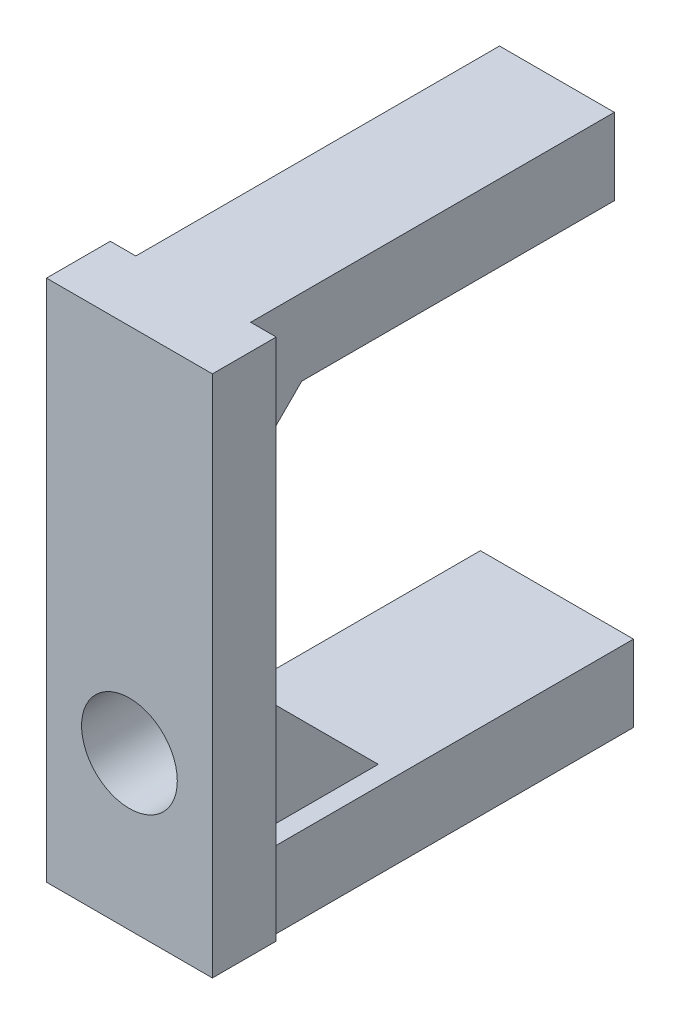
ISO-10303-21;
HEADER;
FILE_DESCRIPTION(('STEP AP214'),'2;1');
FILE_NAME('part.step','',(''),(''),'','','');
FILE_SCHEMA(('AUTOMOTIVE_DESIGN { 1 0 10303 214 1 1 1 1 }'));
ENDSEC;
DATA;
#1=APPLICATION_CONTEXT('core data for automotive mechanical design processes');
#2=APPLICATION_PROTOCOL_DEFINITION('international standard','automotive_design',2000,#1);
#3=PRODUCT_CONTEXT('',#1,'mechanical');
#4=PRODUCT('Part','Part','',(#3));
#5=PRODUCT_RELATED_PRODUCT_CATEGORY('part','',(#4));
#6=PRODUCT_DEFINITION_FORMATION('','',#4);
#7=PRODUCT_DEFINITION_CONTEXT('part definition',#1,'design');
#8=PRODUCT_DEFINITION('design','',#6,#7);
#9=PRODUCT_DEFINITION_SHAPE('','',#8);
#10=(LENGTH_UNIT() NAMED_UNIT(*) SI_UNIT(.MILLI.,.METRE.));
#11=(NAMED_UNIT(*) PLANE_ANGLE_UNIT() SI_UNIT($,.RADIAN.));
#12=(NAMED_UNIT(*) SI_UNIT($,.STERADIAN.) SOLID_ANGLE_UNIT());
#13=UNCERTAINTY_MEASURE_WITH_UNIT(LENGTH_MEASURE(1.E-05),#10,'distance_accuracy_value','');
#14=(GEOMETRIC_REPRESENTATION_CONTEXT(3) GLOBAL_UNCERTAINTY_ASSIGNED_CONTEXT((#13)) GLOBAL_UNIT_ASSIGNED_CONTEXT((#10,
#11,#12)) REPRESENTATION_CONTEXT('',''));
#15=CARTESIAN_POINT('',(0.,0.,0.));
#16=DIRECTION('',(0.,0.,1.));
#17=DIRECTION('',(1.,0.,0.));
#18=AXIS2_PLACEMENT_3D('',#15,#16,#17);
#19=CARTESIAN_POINT('',(0.,167.,83.));
#20=DIRECTION('',(0.,0.,1.));
#21=DIRECTION('',(1.,0.,0.));
#22=AXIS2_PLACEMENT_3D('',#19,#20,#21);
#23=PLANE('',#22);
#24=CARTESIAN_POINT('',(0.,167.,83.));
#25=DIRECTION('',(0.,0.,1.));
#26=DIRECTION('',(1.,0.,0.));
#27=AXIS2_PLACEMENT_3D('',#24,#25,#26);
#28=CIRCLE('',#27,1.4);
#29=CARTESIAN_POINT('',(1.4,167.,83.));
#30=VERTEX_POINT('',#29);
#31=EDGE_CURVE('E9',#30,#30,#28,.T.);
#32=ORIENTED_EDGE('',*,*,#31,.F.);
#33=EDGE_LOOP('',(#32));
#34=FACE_BOUND('',#33,.T.);
#35=ADVANCED_FACE('F14',(#34),#23,.F.);
#36=CARTESIAN_POINT('',(0.,161.,83.));
#37=DIRECTION('',(0.,0.,1.));
#38=DIRECTION('',(1.,0.,0.));
#39=AXIS2_PLACEMENT_3D('',#36,#37,#38);
#40=PLANE('',#39);
#41=CARTESIAN_POINT('',(0.,161.,83.));
#42=DIRECTION('',(0.,0.,1.));
#43=DIRECTION('',(1.,0.,0.));
#44=AXIS2_PLACEMENT_3D('',#41,#42,#43);
#45=CIRCLE('',#44,1.4);
#46=CARTESIAN_POINT('',(1.4,161.,83.));
#47=VERTEX_POINT('',#46);
#48=EDGE_CURVE('E261',#47,#47,#45,.T.);
#49=ORIENTED_EDGE('',*,*,#48,.F.);
#50=EDGE_LOOP('',(#49));
#51=FACE_BOUND('',#50,.T.);
#52=ADVANCED_FACE('F531',(#51),#40,.F.);
#53=CARTESIAN_POINT('',(6.,94.,83.));
#54=DIRECTION('',(0.,0.,1.));
#55=DIRECTION('',(1.,0.,0.));
#56=AXIS2_PLACEMENT_3D('',#53,#54,#55);
#57=PLANE('',#56);
#58=CARTESIAN_POINT('',(6.,94.,83.));
#59=DIRECTION('',(0.,0.,1.));
#60=DIRECTION('',(1.,0.,0.));
#61=AXIS2_PLACEMENT_3D('',#58,#59,#60);
#62=CIRCLE('',#61,1.4);
#63=CARTESIAN_POINT('',(7.4,94.,83.));
#64=VERTEX_POINT('',#63);
#65=EDGE_CURVE('E324',#64,#64,#62,.T.);
#66=ORIENTED_EDGE('',*,*,#65,.F.);
#67=EDGE_LOOP('',(#66));
#68=FACE_BOUND('',#67,.T.);
#69=ADVANCED_FACE('F536',(#68),#57,.F.);
#70=CARTESIAN_POINT('',(-6.,94.,83.));
#71=DIRECTION('',(0.,0.,1.));
#72=DIRECTION('',(1.,0.,0.));
#73=AXIS2_PLACEMENT_3D('',#70,#71,#72);
#74=PLANE('',#73);
#75=CARTESIAN_POINT('',(-6.,94.,83.));
#76=DIRECTION('',(0.,0.,1.));
#77=DIRECTION('',(1.,0.,0.));
#78=AXIS2_PLACEMENT_3D('',#75,#76,#77);
#79=CIRCLE('',#78,1.4);
#80=CARTESIAN_POINT('',(-4.6,94.,83.));
#81=VERTEX_POINT('',#80);
#82=EDGE_CURVE('E276',#81,#81,#79,.T.);
#83=ORIENTED_EDGE('',*,*,#82,.F.);
#84=EDGE_LOOP('',(#83));
#85=FACE_BOUND('',#84,.T.);
#86=ADVANCED_FACE('F555',(#85),#74,.F.);
#87=CARTESIAN_POINT('',(0.,167.,73.));
#88=DIRECTION('',(0.,0.,1.));
#89=DIRECTION('',(1.,0.,0.));
#90=AXIS2_PLACEMENT_3D('',#87,#88,#89);
#91=CYLINDRICAL_SURFACE('',#90,1.4);
#92=DIRECTION('',(0.,0.,1.));
#93=VECTOR('',#92,1.);
#94=CARTESIAN_POINT('',(1.4,167.,73.));
#95=LINE('',#94,#93);
#96=CARTESIAN_POINT('',(1.4,167.,73.));
#97=VERTEX_POINT('',#96);
#98=EDGE_CURVE('E25',#97,#30,#95,.T.);
#99=ORIENTED_EDGE('',*,*,#98,.F.);
#100=CARTESIAN_POINT('',(0.,167.,73.));
#101=DIRECTION('',(0.,0.,1.));
#102=DIRECTION('',(1.,0.,0.));
#103=AXIS2_PLACEMENT_3D('',#100,#101,#102);
#104=CIRCLE('',#103,1.4);
#105=EDGE_CURVE('E281',#97,#97,#104,.T.);
#106=ORIENTED_EDGE('',*,*,#105,.F.);
#107=ORIENTED_EDGE('',*,*,#98,.T.);
#108=ORIENTED_EDGE('',*,*,#31,.T.);
#109=EDGE_LOOP('',(#99,#106,#107,#108));
#110=FACE_BOUND('',#109,.T.);
#111=ADVANCED_FACE('F552',(#110),#91,.F.);
#112=CARTESIAN_POINT('',(0.,161.,73.));
#113=DIRECTION('',(0.,0.,1.));
#114=DIRECTION('',(1.,0.,0.));
#115=AXIS2_PLACEMENT_3D('',#112,#113,#114);
#116=CYLINDRICAL_SURFACE('',#115,1.4);
#117=DIRECTION('',(0.,0.,1.));
#118=VECTOR('',#117,1.);
#119=CARTESIAN_POINT('',(1.4,161.,73.));
#120=LINE('',#119,#118);
#121=CARTESIAN_POINT('',(1.4,161.,73.));
#122=VERTEX_POINT('',#121);
#123=EDGE_CURVE('E328',#122,#47,#120,.T.);
#124=ORIENTED_EDGE('',*,*,#123,.F.);
#125=CARTESIAN_POINT('',(0.,161.,73.));
#126=DIRECTION('',(0.,0.,1.));
#127=DIRECTION('',(1.,0.,0.));
#128=AXIS2_PLACEMENT_3D('',#125,#126,#127);
#129=CIRCLE('',#128,1.4);
#130=EDGE_CURVE('E284',#122,#122,#129,.T.);
#131=ORIENTED_EDGE('',*,*,#130,.F.);
#132=ORIENTED_EDGE('',*,*,#123,.T.);
#133=ORIENTED_EDGE('',*,*,#48,.T.);
#134=EDGE_LOOP('',(#124,#131,#132,#133));
#135=FACE_BOUND('',#134,.T.);
#136=ADVANCED_FACE('F16',(#135),#116,.F.);
#137=CARTESIAN_POINT('',(-9.,158.,73.));
#138=DIRECTION('',(0.,1.,0.));
#139=DIRECTION('',(1.,0.,0.));
#140=AXIS2_PLACEMENT_3D('',#137,#138,#139);
#141=PLANE('',#140);
#142=DIRECTION('',(-1.,0.,0.));
#143=VECTOR('',#142,1.);
#144=CARTESIAN_POINT('',(9.,158.,122.));
#145=LINE('',#144,#143);
#146=CARTESIAN_POINT('',(9.,158.,122.));
#147=VERTEX_POINT('',#146);
#148=CARTESIAN_POINT('',(-9.,158.,122.));
#149=VERTEX_POINT('',#148);
#150=EDGE_CURVE('E377',#147,#149,#145,.T.);
#151=ORIENTED_EDGE('',*,*,#150,.T.);
#152=DIRECTION('',(0.,0.,1.));
#153=VECTOR('',#152,1.);
#154=CARTESIAN_POINT('',(-9.,158.,73.));
#155=LINE('',#154,#153);
#156=CARTESIAN_POINT('',(-9.,158.,73.));
#157=VERTEX_POINT('',#156);
#158=EDGE_CURVE('E254',#157,#149,#155,.T.);
#159=ORIENTED_EDGE('',*,*,#158,.F.);
#160=DIRECTION('',(1.,0.,0.));
#161=VECTOR('',#160,1.);
#162=CARTESIAN_POINT('',(-9.,158.,73.));
#163=LINE('',#162,#161);
#164=CARTESIAN_POINT('',(9.,158.,73.));
#165=VERTEX_POINT('',#164);
#166=EDGE_CURVE('E299',#157,#165,#163,.T.);
#167=ORIENTED_EDGE('',*,*,#166,.T.);
#168=DIRECTION('',(0.,0.,1.));
#169=VECTOR('',#168,1.);
#170=CARTESIAN_POINT('',(9.,158.,73.));
#171=LINE('',#170,#169);
#172=EDGE_CURVE('E373',#165,#147,#171,.T.);
#173=ORIENTED_EDGE('',*,*,#172,.T.);
#174=EDGE_LOOP('',(#151,#159,#167,#173));
#175=FACE_BOUND('',#174,.T.);
#176=ADVANCED_FACE('F516',(#175),#141,.F.);
#177=CARTESIAN_POINT('',(6.,94.,73.));
#178=DIRECTION('',(0.,0.,1.));
#179=DIRECTION('',(1.,0.,0.));
#180=AXIS2_PLACEMENT_3D('',#177,#178,#179);
#181=CYLINDRICAL_SURFACE('',#180,1.4);
#182=DIRECTION('',(0.,0.,1.));
#183=VECTOR('',#182,1.);
#184=CARTESIAN_POINT('',(7.4,94.,73.));
#185=LINE('',#184,#183);
#186=CARTESIAN_POINT('',(7.4,94.,73.));
#187=VERTEX_POINT('',#186);
#188=EDGE_CURVE('E279',#187,#64,#185,.T.);
#189=ORIENTED_EDGE('',*,*,#188,.F.);
#190=CARTESIAN_POINT('',(6.,94.,73.));
#191=DIRECTION('',(0.,0.,1.));
#192=DIRECTION('',(1.,0.,0.));
#193=AXIS2_PLACEMENT_3D('',#190,#191,#192);
#194=CIRCLE('',#193,1.4);
#195=EDGE_CURVE('E217',#187,#187,#194,.T.);
#196=ORIENTED_EDGE('',*,*,#195,.F.);
#197=ORIENTED_EDGE('',*,*,#188,.T.);
#198=ORIENTED_EDGE('',*,*,#65,.T.);
#199=EDGE_LOOP('',(#189,#196,#197,#198));
#200=FACE_BOUND('',#199,.T.);
#201=ADVANCED_FACE('F560',(#200),#181,.F.);
#202=CARTESIAN_POINT('',(-6.,94.,73.));
#203=DIRECTION('',(0.,0.,1.));
#204=DIRECTION('',(1.,0.,0.));
#205=AXIS2_PLACEMENT_3D('',#202,#203,#204);
#206=CYLINDRICAL_SURFACE('',#205,1.4);
#207=DIRECTION('',(0.,0.,1.));
#208=VECTOR('',#207,1.);
#209=CARTESIAN_POINT('',(-4.6,94.,73.));
#210=LINE('',#209,#208);
#211=CARTESIAN_POINT('',(-4.6,94.,73.));
#212=VERTEX_POINT('',#211);
#213=EDGE_CURVE('E280',#212,#81,#210,.T.);
#214=ORIENTED_EDGE('',*,*,#213,.F.);
#215=CARTESIAN_POINT('',(-6.,94.,73.));
#216=DIRECTION('',(0.,0.,1.));
#217=DIRECTION('',(1.,0.,0.));
#218=AXIS2_PLACEMENT_3D('',#215,#216,#217);
#219=CIRCLE('',#218,1.4);
#220=EDGE_CURVE('E224',#212,#212,#219,.T.);
#221=ORIENTED_EDGE('',*,*,#220,.F.);
#222=ORIENTED_EDGE('',*,*,#213,.T.);
#223=ORIENTED_EDGE('',*,*,#82,.T.);
#224=EDGE_LOOP('',(#214,#221,#222,#223));
#225=FACE_BOUND('',#224,.T.);
#226=ADVANCED_FACE('F722',(#225),#206,.F.);
#227=CARTESIAN_POINT('',(0.,150.,130.));
#228=DIRECTION('',(0.,-0.707106781186548,-0.707106781186548));
#229=DIRECTION('',(0.,-0.707106781186548,0.707106781186548));
#230=AXIS2_PLACEMENT_3D('',#227,#228,#229);
#231=PLANE('',#230);
#232=DIRECTION('',(1.,0.,0.));
#233=VECTOR('',#232,1.);
#234=CARTESIAN_POINT('',(-9.,150.,130.));
#235=LINE('',#234,#233);
#236=CARTESIAN_POINT('',(-9.,150.,130.));
#237=VERTEX_POINT('',#236);
#238=CARTESIAN_POINT('',(9.,150.,130.));
#239=VERTEX_POINT('',#238);
#240=EDGE_CURVE('E419',#237,#239,#235,.T.);
#241=ORIENTED_EDGE('',*,*,#240,.F.);
#242=DIRECTION('',(0.,0.707106781186548,-0.707106781186548));
#243=VECTOR('',#242,1.);
#244=CARTESIAN_POINT('',(-9.,150.,130.));
#245=LINE('',#244,#243);
#246=EDGE_CURVE('E18',#237,#149,#245,.T.);
#247=ORIENTED_EDGE('',*,*,#246,.T.);
#248=ORIENTED_EDGE('',*,*,#150,.F.);
#249=DIRECTION('',(0.,0.707106781186548,-0.707106781186548));
#250=VECTOR('',#249,1.);
#251=CARTESIAN_POINT('',(9.,150.,130.));
#252=LINE('',#251,#250);
#253=EDGE_CURVE('E334',#239,#147,#252,.T.);
#254=ORIENTED_EDGE('',*,*,#253,.F.);
#255=EDGE_LOOP('',(#241,#247,#248,#254));
#256=FACE_BOUND('',#255,.T.);
#257=ADVANCED_FACE('F514',(#256),#231,.T.);
#258=CARTESIAN_POINT('',(9.,107.07106781186,122.92893218813));
#259=DIRECTION('',(-1.,0.,0.));
#260=DIRECTION('',(0.,0.,1.));
#261=AXIS2_PLACEMENT_3D('',#258,#259,#260);
#262=PLANE('',#261);
#263=DIRECTION('',(0.,0.,1.));
#264=VECTOR('',#263,1.);
#265=CARTESIAN_POINT('',(9.,100.,110.));
#266=LINE('',#265,#264);
#267=CARTESIAN_POINT('',(9.,100.,110.));
#268=VERTEX_POINT('',#267);
#269=CARTESIAN_POINT('',(9.,100.,130.));
#270=VERTEX_POINT('',#269);
#271=EDGE_CURVE('E321',#268,#270,#266,.T.);
#272=ORIENTED_EDGE('',*,*,#271,.F.);
#273=DIRECTION('',(0.,-0.707106781186548,-0.707106781186548));
#274=VECTOR('',#273,1.);
#275=CARTESIAN_POINT('',(9.,120.,130.));
#276=LINE('',#275,#274);
#277=CARTESIAN_POINT('',(9.,120.,130.));
#278=VERTEX_POINT('',#277);
#279=EDGE_CURVE('E320',#278,#268,#276,.T.);
#280=ORIENTED_EDGE('',*,*,#279,.F.);
#281=DIRECTION('',(0.,1.,0.));
#282=VECTOR('',#281,1.);
#283=CARTESIAN_POINT('',(9.,100.,130.));
#284=LINE('',#283,#282);
#285=EDGE_CURVE('E406',#270,#278,#284,.T.);
#286=ORIENTED_EDGE('',*,*,#285,.F.);
#287=EDGE_LOOP('',(#272,#280,#286));
#288=FACE_BOUND('',#287,.T.);
#289=ADVANCED_FACE('F447',(#288),#262,.F.);
#290=CARTESIAN_POINT('',(0.,120.,130.));
#291=DIRECTION('',(0.,0.707106781186548,-0.707106781186548));
#292=DIRECTION('',(-1.,0.,0.));
#293=AXIS2_PLACEMENT_3D('',#290,#291,#292);
#294=PLANE('',#293);
#295=CARTESIAN_POINT('',(0.,112.,122.));
#296=DIRECTION('',(0.,0.707106781186548,-0.707106781186548));
#297=DIRECTION('',(0.,0.707106781186548,0.707106781186548));
#298=AXIS2_PLACEMENT_3D('',#295,#296,#297);
#299=ELLIPSE('',#298,10.606601717798,7.5);
#300=CARTESIAN_POINT('',(7.5,112.,122.));
#301=VERTEX_POINT('',#300);
#302=EDGE_CURVE('E401',#301,#301,#299,.T.);
#303=ORIENTED_EDGE('',*,*,#302,.F.);
#304=EDGE_LOOP('',(#303));
#305=FACE_BOUND('',#304,.T.);
#306=DIRECTION('',(-1.,0.,0.));
#307=VECTOR('',#306,1.);
#308=CARTESIAN_POINT('',(9.,120.,130.));
#309=LINE('',#308,#307);
#310=CARTESIAN_POINT('',(-9.,120.,130.));
#311=VERTEX_POINT('',#310);
#312=EDGE_CURVE('E385',#278,#311,#309,.T.);
#313=ORIENTED_EDGE('',*,*,#312,.F.);
#314=ORIENTED_EDGE('',*,*,#279,.T.);
#315=DIRECTION('',(1.,0.,0.));
#316=VECTOR('',#315,1.);
#317=CARTESIAN_POINT('',(-9.,100.,110.));
#318=LINE('',#317,#316);
#319=CARTESIAN_POINT('',(-9.,100.,110.));
#320=VERTEX_POINT('',#319);
#321=EDGE_CURVE('E269',#320,#268,#318,.T.);
#322=ORIENTED_EDGE('',*,*,#321,.F.);
#323=DIRECTION('',(0.,-0.707106781186548,-0.707106781186548));
#324=VECTOR('',#323,1.);
#325=CARTESIAN_POINT('',(-9.,120.,130.));
#326=LINE('',#325,#324);
#327=EDGE_CURVE('E317',#311,#320,#326,.T.);
#328=ORIENTED_EDGE('',*,*,#327,.F.);
#329=EDGE_LOOP('',(#313,#314,#322,#328));
#330=FACE_BOUND('',#329,.T.);
#331=ADVANCED_FACE('F440',(#305,#330),#294,.T.);
#332=CARTESIAN_POINT('',(-9.,107.07106781186,122.92893218813));
#333=DIRECTION('',(-1.,0.,0.));
#334=DIRECTION('',(0.,0.,1.));
#335=AXIS2_PLACEMENT_3D('',#332,#333,#334);
#336=PLANE('',#335);
#337=DIRECTION('',(0.,1.,0.));
#338=VECTOR('',#337,1.);
#339=CARTESIAN_POINT('',(-9.,100.,130.));
#340=LINE('',#339,#338);
#341=CARTESIAN_POINT('',(-9.,100.,130.));
#342=VERTEX_POINT('',#341);
#343=EDGE_CURVE('E381',#342,#311,#340,.T.);
#344=ORIENTED_EDGE('',*,*,#343,.T.);
#345=ORIENTED_EDGE('',*,*,#327,.T.);
#346=DIRECTION('',(0.,0.,1.));
#347=VECTOR('',#346,1.);
#348=CARTESIAN_POINT('',(-9.,100.,110.));
#349=LINE('',#348,#347);
#350=EDGE_CURVE('E258',#320,#342,#349,.T.);
#351=ORIENTED_EDGE('',*,*,#350,.T.);
#352=EDGE_LOOP('',(#344,#345,#351));
#353=FACE_BOUND('',#352,.T.);
#354=ADVANCED_FACE('F445',(#353),#336,.T.);
#355=CARTESIAN_POINT('',(-12.,100.,73.));
#356=DIRECTION('',(0.,1.,0.));
#357=DIRECTION('',(1.,0.,0.));
#358=AXIS2_PLACEMENT_3D('',#355,#356,#357);
#359=PLANE('',#358);
#360=DIRECTION('',(0.,0.,1.));
#361=VECTOR('',#360,1.);
#362=CARTESIAN_POINT('',(12.,100.,73.));
#363=LINE('',#362,#361);
#364=CARTESIAN_POINT('',(12.,100.,73.));
#365=VERTEX_POINT('',#364);
#366=CARTESIAN_POINT('',(12.,100.,130.));
#367=VERTEX_POINT('',#366);
#368=EDGE_CURVE('E229',#365,#367,#363,.T.);
#369=ORIENTED_EDGE('',*,*,#368,.F.);
#370=DIRECTION('',(1.,0.,0.));
#371=VECTOR('',#370,1.);
#372=CARTESIAN_POINT('',(-12.,100.,73.));
#373=LINE('',#372,#371);
#374=CARTESIAN_POINT('',(-12.,100.,73.));
#375=VERTEX_POINT('',#374);
#376=EDGE_CURVE('E210',#375,#365,#373,.T.);
#377=ORIENTED_EDGE('',*,*,#376,.F.);
#378=DIRECTION('',(0.,0.,1.));
#379=VECTOR('',#378,1.);
#380=CARTESIAN_POINT('',(-12.,100.,73.));
#381=LINE('',#380,#379);
#382=CARTESIAN_POINT('',(-12.,100.,130.));
#383=VERTEX_POINT('',#382);
#384=EDGE_CURVE('E208',#375,#383,#381,.T.);
#385=ORIENTED_EDGE('',*,*,#384,.T.);
#386=DIRECTION('',(1.,0.,0.));
#387=VECTOR('',#386,1.);
#388=CARTESIAN_POINT('',(-12.,100.,130.));
#389=LINE('',#388,#387);
#390=EDGE_CURVE('E241',#383,#342,#389,.T.);
#391=ORIENTED_EDGE('',*,*,#390,.T.);
#392=ORIENTED_EDGE('',*,*,#350,.F.);
#393=ORIENTED_EDGE('',*,*,#321,.T.);
#394=ORIENTED_EDGE('',*,*,#271,.T.);
#395=DIRECTION('',(1.,0.,0.));
#396=VECTOR('',#395,1.);
#397=CARTESIAN_POINT('',(-12.,100.,130.));
#398=LINE('',#397,#396);
#399=EDGE_CURVE('E306',#270,#367,#398,.T.);
#400=ORIENTED_EDGE('',*,*,#399,.T.);
#401=EDGE_LOOP('',(#369,#377,#385,#391,#392,#393,#394,#400));
#402=FACE_BOUND('',#401,.T.);
#403=ADVANCED_FACE('F226',(#402),#359,.T.);
#404=CARTESIAN_POINT('',(-9.,158.,73.));
#405=DIRECTION('',(1.,0.,0.));
#406=DIRECTION('',(0.,1.,0.));
#407=AXIS2_PLACEMENT_3D('',#404,#405,#406);
#408=PLANE('',#407);
#409=ORIENTED_EDGE('',*,*,#246,.F.);
#410=DIRECTION('',(0.,-1.,0.));
#411=VECTOR('',#410,1.);
#412=CARTESIAN_POINT('',(-9.,170.,130.));
#413=LINE('',#412,#411);
#414=CARTESIAN_POINT('',(-9.,170.,130.));
#415=VERTEX_POINT('',#414);
#416=EDGE_CURVE('E316',#415,#237,#413,.T.);
#417=ORIENTED_EDGE('',*,*,#416,.F.);
#418=DIRECTION('',(0.,0.,1.));
#419=VECTOR('',#418,1.);
#420=CARTESIAN_POINT('',(-9.,170.,73.));
#421=LINE('',#420,#419);
#422=CARTESIAN_POINT('',(-9.,170.,73.));
#423=VERTEX_POINT('',#422);
#424=EDGE_CURVE('E311',#423,#415,#421,.T.);
#425=ORIENTED_EDGE('',*,*,#424,.F.);
#426=DIRECTION('',(0.,1.,0.));
#427=VECTOR('',#426,1.);
#428=CARTESIAN_POINT('',(-9.,158.,73.));
#429=LINE('',#428,#427);
#430=EDGE_CURVE('E292',#157,#423,#429,.T.);
#431=ORIENTED_EDGE('',*,*,#430,.F.);
#432=ORIENTED_EDGE('',*,*,#158,.T.);
#433=EDGE_LOOP('',(#409,#417,#425,#431,#432));
#434=FACE_BOUND('',#433,.T.);
#435=ADVANCED_FACE('F510',(#434),#408,.F.);
#436=CARTESIAN_POINT('',(-9.,158.,73.));
#437=DIRECTION('',(0.,0.,1.));
#438=DIRECTION('',(1.,0.,0.));
#439=AXIS2_PLACEMENT_3D('',#436,#437,#438);
#440=PLANE('',#439);
#441=ORIENTED_EDGE('',*,*,#105,.T.);
#442=EDGE_LOOP('',(#441));
#443=FACE_BOUND('',#442,.T.);
#444=ORIENTED_EDGE('',*,*,#130,.T.);
#445=EDGE_LOOP('',(#444));
#446=FACE_BOUND('',#445,.T.);
#447=DIRECTION('',(1.,0.,0.));
#448=VECTOR('',#447,1.);
#449=CARTESIAN_POINT('',(-9.,170.,73.));
#450=LINE('',#449,#448);
#451=CARTESIAN_POINT('',(9.,170.,73.));
#452=VERTEX_POINT('',#451);
#453=EDGE_CURVE('E308',#423,#452,#450,.T.);
#454=ORIENTED_EDGE('',*,*,#453,.T.);
#455=DIRECTION('',(0.,1.,0.));
#456=VECTOR('',#455,1.);
#457=CARTESIAN_POINT('',(9.,158.,73.));
#458=LINE('',#457,#456);
#459=EDGE_CURVE('E147',#165,#452,#458,.T.);
#460=ORIENTED_EDGE('',*,*,#459,.F.);
#461=ORIENTED_EDGE('',*,*,#166,.F.);
#462=ORIENTED_EDGE('',*,*,#430,.T.);
#463=EDGE_LOOP('',(#454,#460,#461,#462));
#464=FACE_BOUND('',#463,.T.);
#465=ADVANCED_FACE('F518',(#443,#446,#464),#440,.F.);
#466=CARTESIAN_POINT('',(9.,158.,73.));
#467=DIRECTION('',(1.,0.,0.));
#468=DIRECTION('',(0.,1.,0.));
#469=AXIS2_PLACEMENT_3D('',#466,#467,#468);
#470=PLANE('',#469);
#471=ORIENTED_EDGE('',*,*,#172,.F.);
#472=ORIENTED_EDGE('',*,*,#459,.T.);
#473=DIRECTION('',(0.,0.,1.));
#474=VECTOR('',#473,1.);
#475=CARTESIAN_POINT('',(9.,170.,73.));
#476=LINE('',#475,#474);
#477=CARTESIAN_POINT('',(9.,170.,130.));
#478=VERTEX_POINT('',#477);
#479=EDGE_CURVE('E312',#452,#478,#476,.T.);
#480=ORIENTED_EDGE('',*,*,#479,.T.);
#481=DIRECTION('',(0.,1.,0.));
#482=VECTOR('',#481,1.);
#483=CARTESIAN_POINT('',(9.,150.,130.));
#484=LINE('',#483,#482);
#485=EDGE_CURVE('E136',#239,#478,#484,.T.);
#486=ORIENTED_EDGE('',*,*,#485,.F.);
#487=ORIENTED_EDGE('',*,*,#253,.T.);
#488=EDGE_LOOP('',(#471,#472,#480,#486,#487));
#489=FACE_BOUND('',#488,.T.);
#490=ADVANCED_FACE('F470',(#489),#470,.T.);
#491=CARTESIAN_POINT('',(0.,112.,85.));
#492=DIRECTION('',(0.,0.,1.));
#493=DIRECTION('',(1.,0.,0.));
#494=AXIS2_PLACEMENT_3D('',#491,#492,#493);
#495=CYLINDRICAL_SURFACE('',#494,7.5);
#496=DIRECTION('',(0.,0.,1.));
#497=VECTOR('',#496,1.);
#498=CARTESIAN_POINT('',(7.5,112.,85.));
#499=LINE('',#498,#497);
#500=CARTESIAN_POINT('',(7.5,112.,140.));
#501=VERTEX_POINT('',#500);
#502=EDGE_CURVE('E216',#301,#501,#499,.T.);
#503=ORIENTED_EDGE('',*,*,#502,.F.);
#504=ORIENTED_EDGE('',*,*,#302,.T.);
#505=ORIENTED_EDGE('',*,*,#502,.T.);
#506=CARTESIAN_POINT('',(0.,112.,140.));
#507=DIRECTION('',(0.,0.,1.));
#508=DIRECTION('',(1.,0.,0.));
#509=AXIS2_PLACEMENT_3D('',#506,#507,#508);
#510=CIRCLE('',#509,7.5);
#511=EDGE_CURVE('E340',#501,#501,#510,.T.);
#512=ORIENTED_EDGE('',*,*,#511,.T.);
#513=EDGE_LOOP('',(#503,#504,#505,#512));
#514=FACE_BOUND('',#513,.T.);
#515=ADVANCED_FACE('F526',(#514),#495,.F.);
#516=CARTESIAN_POINT('',(-12.,88.,73.));
#517=DIRECTION('',(1.,0.,0.));
#518=DIRECTION('',(0.,1.,0.));
#519=AXIS2_PLACEMENT_3D('',#516,#517,#518);
#520=PLANE('',#519);
#521=DIRECTION('',(0.,1.,0.));
#522=VECTOR('',#521,1.);
#523=CARTESIAN_POINT('',(-12.,88.,130.));
#524=LINE('',#523,#522);
#525=CARTESIAN_POINT('',(-12.,88.,130.));
#526=VERTEX_POINT('',#525);
#527=EDGE_CURVE('E173',#526,#383,#524,.T.);
#528=ORIENTED_EDGE('',*,*,#527,.T.);
#529=ORIENTED_EDGE('',*,*,#384,.F.);
#530=DIRECTION('',(0.,1.,0.));
#531=VECTOR('',#530,1.);
#532=CARTESIAN_POINT('',(-12.,88.,73.));
#533=LINE('',#532,#531);
#534=CARTESIAN_POINT('',(-12.,88.,73.));
#535=VERTEX_POINT('',#534);
#536=EDGE_CURVE('E166',#535,#375,#533,.T.);
#537=ORIENTED_EDGE('',*,*,#536,.F.);
#538=DIRECTION('',(0.,0.,1.));
#539=VECTOR('',#538,1.);
#540=CARTESIAN_POINT('',(-12.,88.,73.));
#541=LINE('',#540,#539);
#542=EDGE_CURVE('E274',#535,#526,#541,.T.);
#543=ORIENTED_EDGE('',*,*,#542,.T.);
#544=EDGE_LOOP('',(#528,#529,#537,#543));
#545=FACE_BOUND('',#544,.T.);
#546=ADVANCED_FACE('F214',(#545),#520,.F.);
#547=CARTESIAN_POINT('',(-12.,88.,73.));
#548=DIRECTION('',(0.,0.,1.));
#549=DIRECTION('',(1.,0.,0.));
#550=AXIS2_PLACEMENT_3D('',#547,#548,#549);
#551=PLANE('',#550);
#552=ORIENTED_EDGE('',*,*,#195,.T.);
#553=EDGE_LOOP('',(#552));
#554=FACE_BOUND('',#553,.T.);
#555=ORIENTED_EDGE('',*,*,#220,.T.);
#556=EDGE_LOOP('',(#555));
#557=FACE_BOUND('',#556,.T.);
#558=ORIENTED_EDGE('',*,*,#376,.T.);
#559=DIRECTION('',(0.,1.,0.));
#560=VECTOR('',#559,1.);
#561=CARTESIAN_POINT('',(12.,88.,73.));
#562=LINE('',#561,#560);
#563=CARTESIAN_POINT('',(12.,88.,73.));
#564=VERTEX_POINT('',#563);
#565=EDGE_CURVE('E184',#564,#365,#562,.T.);
#566=ORIENTED_EDGE('',*,*,#565,.F.);
#567=DIRECTION('',(1.,0.,0.));
#568=VECTOR('',#567,1.);
#569=CARTESIAN_POINT('',(-12.,88.,73.));
#570=LINE('',#569,#568);
#571=EDGE_CURVE('E221',#535,#564,#570,.T.);
#572=ORIENTED_EDGE('',*,*,#571,.F.);
#573=ORIENTED_EDGE('',*,*,#536,.T.);
#574=EDGE_LOOP('',(#558,#566,#572,#573));
#575=FACE_BOUND('',#574,.T.);
#576=ADVANCED_FACE('F219',(#554,#557,#575),#551,.F.);
#577=CARTESIAN_POINT('',(12.,88.,73.));
#578=DIRECTION('',(1.,0.,0.));
#579=DIRECTION('',(0.,1.,0.));
#580=AXIS2_PLACEMENT_3D('',#577,#578,#579);
#581=PLANE('',#580);
#582=DIRECTION('',(0.,0.,1.));
#583=VECTOR('',#582,1.);
#584=CARTESIAN_POINT('',(12.,88.,73.));
#585=LINE('',#584,#583);
#586=CARTESIAN_POINT('',(12.,88.,130.));
#587=VERTEX_POINT('',#586);
#588=EDGE_CURVE('E243',#564,#587,#585,.T.);
#589=ORIENTED_EDGE('',*,*,#588,.F.);
#590=ORIENTED_EDGE('',*,*,#565,.T.);
#591=ORIENTED_EDGE('',*,*,#368,.T.);
#592=DIRECTION('',(0.,1.,0.));
#593=VECTOR('',#592,1.);
#594=CARTESIAN_POINT('',(12.,88.,130.));
#595=LINE('',#594,#593);
#596=EDGE_CURVE('E303',#587,#367,#595,.T.);
#597=ORIENTED_EDGE('',*,*,#596,.F.);
#598=EDGE_LOOP('',(#589,#590,#591,#597));
#599=FACE_BOUND('',#598,.T.);
#600=ADVANCED_FACE('F483',(#599),#581,.T.);
#601=CARTESIAN_POINT('',(13.,88.,130.));
#602=DIRECTION('',(1.,0.,0.));
#603=DIRECTION('',(0.,1.,0.));
#604=AXIS2_PLACEMENT_3D('',#601,#602,#603);
#605=PLANE('',#604);
#606=DIRECTION('',(0.,0.,1.));
#607=VECTOR('',#606,1.);
#608=CARTESIAN_POINT('',(13.,88.,130.));
#609=LINE('',#608,#607);
#610=CARTESIAN_POINT('',(13.,88.,130.));
#611=VERTEX_POINT('',#610);
#612=CARTESIAN_POINT('',(13.,88.,140.));
#613=VERTEX_POINT('',#612);
#614=EDGE_CURVE('E354',#611,#613,#609,.T.);
#615=ORIENTED_EDGE('',*,*,#614,.F.);
#616=DIRECTION('',(0.,1.,0.));
#617=VECTOR('',#616,1.);
#618=CARTESIAN_POINT('',(13.,88.,130.));
#619=LINE('',#618,#617);
#620=CARTESIAN_POINT('',(13.,170.,130.));
#621=VERTEX_POINT('',#620);
#622=EDGE_CURVE('E307',#611,#621,#619,.T.);
#623=ORIENTED_EDGE('',*,*,#622,.T.);
#624=DIRECTION('',(0.,0.,1.));
#625=VECTOR('',#624,1.);
#626=CARTESIAN_POINT('',(13.,170.,130.));
#627=LINE('',#626,#625);
#628=CARTESIAN_POINT('',(13.,170.,140.));
#629=VERTEX_POINT('',#628);
#630=EDGE_CURVE('E347',#621,#629,#627,.T.);
#631=ORIENTED_EDGE('',*,*,#630,.T.);
#632=DIRECTION('',(0.,1.,0.));
#633=VECTOR('',#632,1.);
#634=CARTESIAN_POINT('',(13.,88.,140.));
#635=LINE('',#634,#633);
#636=EDGE_CURVE('E248',#613,#629,#635,.T.);
#637=ORIENTED_EDGE('',*,*,#636,.F.);
#638=EDGE_LOOP('',(#615,#623,#631,#637));
#639=FACE_BOUND('',#638,.T.);
#640=ADVANCED_FACE('F478',(#639),#605,.T.);
#641=CARTESIAN_POINT('',(-13.,88.,130.));
#642=DIRECTION('',(0.,0.,1.));
#643=DIRECTION('',(1.,0.,0.));
#644=AXIS2_PLACEMENT_3D('',#641,#642,#643);
#645=PLANE('',#644);
#646=ORIENTED_EDGE('',*,*,#416,.T.);
#647=ORIENTED_EDGE('',*,*,#240,.T.);
#648=ORIENTED_EDGE('',*,*,#485,.T.);
#649=DIRECTION('',(1.,0.,0.));
#650=VECTOR('',#649,1.);
#651=CARTESIAN_POINT('',(-13.,170.,130.));
#652=LINE('',#651,#650);
#653=EDGE_CURVE('E344',#478,#621,#652,.T.);
#654=ORIENTED_EDGE('',*,*,#653,.T.);
#655=ORIENTED_EDGE('',*,*,#622,.F.);
#656=DIRECTION('',(1.,0.,0.));
#657=VECTOR('',#656,1.);
#658=CARTESIAN_POINT('',(-13.,88.,130.));
#659=LINE('',#658,#657);
#660=EDGE_CURVE('E247',#587,#611,#659,.T.);
#661=ORIENTED_EDGE('',*,*,#660,.F.);
#662=ORIENTED_EDGE('',*,*,#596,.T.);
#663=ORIENTED_EDGE('',*,*,#399,.F.);
#664=ORIENTED_EDGE('',*,*,#285,.T.);
#665=ORIENTED_EDGE('',*,*,#312,.T.);
#666=ORIENTED_EDGE('',*,*,#343,.F.);
#667=ORIENTED_EDGE('',*,*,#390,.F.);
#668=ORIENTED_EDGE('',*,*,#527,.F.);
#669=DIRECTION('',(1.,0.,0.));
#670=VECTOR('',#669,1.);
#671=CARTESIAN_POINT('',(-13.,88.,130.));
#672=LINE('',#671,#670);
#673=CARTESIAN_POINT('',(-13.,88.,130.));
#674=VERTEX_POINT('',#673);
#675=EDGE_CURVE('E253',#674,#526,#672,.T.);
#676=ORIENTED_EDGE('',*,*,#675,.F.);
#677=DIRECTION('',(0.,1.,0.));
#678=VECTOR('',#677,1.);
#679=CARTESIAN_POINT('',(-13.,88.,130.));
#680=LINE('',#679,#678);
#681=CARTESIAN_POINT('',(-13.,170.,130.));
#682=VERTEX_POINT('',#681);
#683=EDGE_CURVE('E275',#674,#682,#680,.T.);
#684=ORIENTED_EDGE('',*,*,#683,.T.);
#685=DIRECTION('',(1.,0.,0.));
#686=VECTOR('',#685,1.);
#687=CARTESIAN_POINT('',(-13.,170.,130.));
#688=LINE('',#687,#686);
#689=EDGE_CURVE('E239',#682,#415,#688,.T.);
#690=ORIENTED_EDGE('',*,*,#689,.T.);
#691=EDGE_LOOP('',(#646,#647,#648,#654,#655,#661,#662,#663,#664,#665,#666,#667,#668,#676,#684,#690));
#692=FACE_BOUND('',#691,.T.);
#693=ADVANCED_FACE('F433',(#692),#645,.F.);
#694=CARTESIAN_POINT('',(-13.,170.,130.));
#695=DIRECTION('',(0.,1.,0.));
#696=DIRECTION('',(1.,0.,0.));
#697=AXIS2_PLACEMENT_3D('',#694,#695,#696);
#698=PLANE('',#697);
#699=ORIENTED_EDGE('',*,*,#689,.F.);
#700=DIRECTION('',(0.,0.,1.));
#701=VECTOR('',#700,1.);
#702=CARTESIAN_POINT('',(-13.,170.,130.));
#703=LINE('',#702,#701);
#704=CARTESIAN_POINT('',(-13.,170.,140.));
#705=VERTEX_POINT('',#704);
#706=EDGE_CURVE('E266',#682,#705,#703,.T.);
#707=ORIENTED_EDGE('',*,*,#706,.T.);
#708=DIRECTION('',(1.,0.,0.));
#709=VECTOR('',#708,1.);
#710=CARTESIAN_POINT('',(-13.,170.,140.));
#711=LINE('',#710,#709);
#712=EDGE_CURVE('E252',#705,#629,#711,.T.);
#713=ORIENTED_EDGE('',*,*,#712,.T.);
#714=ORIENTED_EDGE('',*,*,#630,.F.);
#715=ORIENTED_EDGE('',*,*,#653,.F.);
#716=ORIENTED_EDGE('',*,*,#479,.F.);
#717=ORIENTED_EDGE('',*,*,#453,.F.);
#718=ORIENTED_EDGE('',*,*,#424,.T.);
#719=EDGE_LOOP('',(#699,#707,#713,#714,#715,#716,#717,#718));
#720=FACE_BOUND('',#719,.T.);
#721=ADVANCED_FACE('F474',(#720),#698,.T.);
#722=CARTESIAN_POINT('',(-13.,88.,140.));
#723=DIRECTION('',(0.,0.,1.));
#724=DIRECTION('',(1.,0.,0.));
#725=AXIS2_PLACEMENT_3D('',#722,#723,#724);
#726=PLANE('',#725);
#727=ORIENTED_EDGE('',*,*,#511,.F.);
#728=EDGE_LOOP('',(#727));
#729=FACE_BOUND('',#728,.T.);
#730=DIRECTION('',(0.,1.,0.));
#731=VECTOR('',#730,1.);
#732=CARTESIAN_POINT('',(-13.,88.,140.));
#733=LINE('',#732,#731);
#734=CARTESIAN_POINT('',(-13.,88.,140.));
#735=VERTEX_POINT('',#734);
#736=EDGE_CURVE('E262',#735,#705,#733,.T.);
#737=ORIENTED_EDGE('',*,*,#736,.F.);
#738=DIRECTION('',(1.,0.,0.));
#739=VECTOR('',#738,1.);
#740=CARTESIAN_POINT('',(-13.,88.,140.));
#741=LINE('',#740,#739);
#742=EDGE_CURVE('E351',#735,#613,#741,.T.);
#743=ORIENTED_EDGE('',*,*,#742,.T.);
#744=ORIENTED_EDGE('',*,*,#636,.T.);
#745=ORIENTED_EDGE('',*,*,#712,.F.);
#746=EDGE_LOOP('',(#737,#743,#744,#745));
#747=FACE_BOUND('',#746,.T.);
#748=ADVANCED_FACE('F500',(#729,#747),#726,.T.);
#749=CARTESIAN_POINT('',(-13.,88.,130.));
#750=DIRECTION('',(0.,1.,0.));
#751=DIRECTION('',(1.,0.,0.));
#752=AXIS2_PLACEMENT_3D('',#749,#750,#751);
#753=PLANE('',#752);
#754=ORIENTED_EDGE('',*,*,#542,.F.);
#755=ORIENTED_EDGE('',*,*,#571,.T.);
#756=ORIENTED_EDGE('',*,*,#588,.T.);
#757=ORIENTED_EDGE('',*,*,#660,.T.);
#758=ORIENTED_EDGE('',*,*,#614,.T.);
#759=ORIENTED_EDGE('',*,*,#742,.F.);
#760=DIRECTION('',(0.,0.,1.));
#761=VECTOR('',#760,1.);
#762=CARTESIAN_POINT('',(-13.,88.,130.));
#763=LINE('',#762,#761);
#764=EDGE_CURVE('E270',#674,#735,#763,.T.);
#765=ORIENTED_EDGE('',*,*,#764,.F.);
#766=ORIENTED_EDGE('',*,*,#675,.T.);
#767=EDGE_LOOP('',(#754,#755,#756,#757,#758,#759,#765,#766));
#768=FACE_BOUND('',#767,.T.);
#769=ADVANCED_FACE('F481',(#768),#753,.F.);
#770=CARTESIAN_POINT('',(-13.,88.,130.));
#771=DIRECTION('',(1.,0.,0.));
#772=DIRECTION('',(0.,1.,0.));
#773=AXIS2_PLACEMENT_3D('',#770,#771,#772);
#774=PLANE('',#773);
#775=ORIENTED_EDGE('',*,*,#736,.T.);
#776=ORIENTED_EDGE('',*,*,#706,.F.);
#777=ORIENTED_EDGE('',*,*,#683,.F.);
#778=ORIENTED_EDGE('',*,*,#764,.T.);
#779=EDGE_LOOP('',(#775,#776,#777,#778));
#780=FACE_BOUND('',#779,.T.);
#781=ADVANCED_FACE('F504',(#780),#774,.F.);
#782=CLOSED_SHELL('',(#35,#52,#69,#86,#111,#136,#176,#201,#226,#257,#289,#331,#354,#403,#435,
#465,#490,#515,#546,#576,#600,#640,#693,#721,#748,#769,#781));
#783=MANIFOLD_SOLID_BREP('B1',#782);
#784=ADVANCED_BREP_SHAPE_REPRESENTATION('',(#18,#783),#14);
#785=SHAPE_DEFINITION_REPRESENTATION(#9,#784);
ENDSEC;
END-ISO-10303-21;
